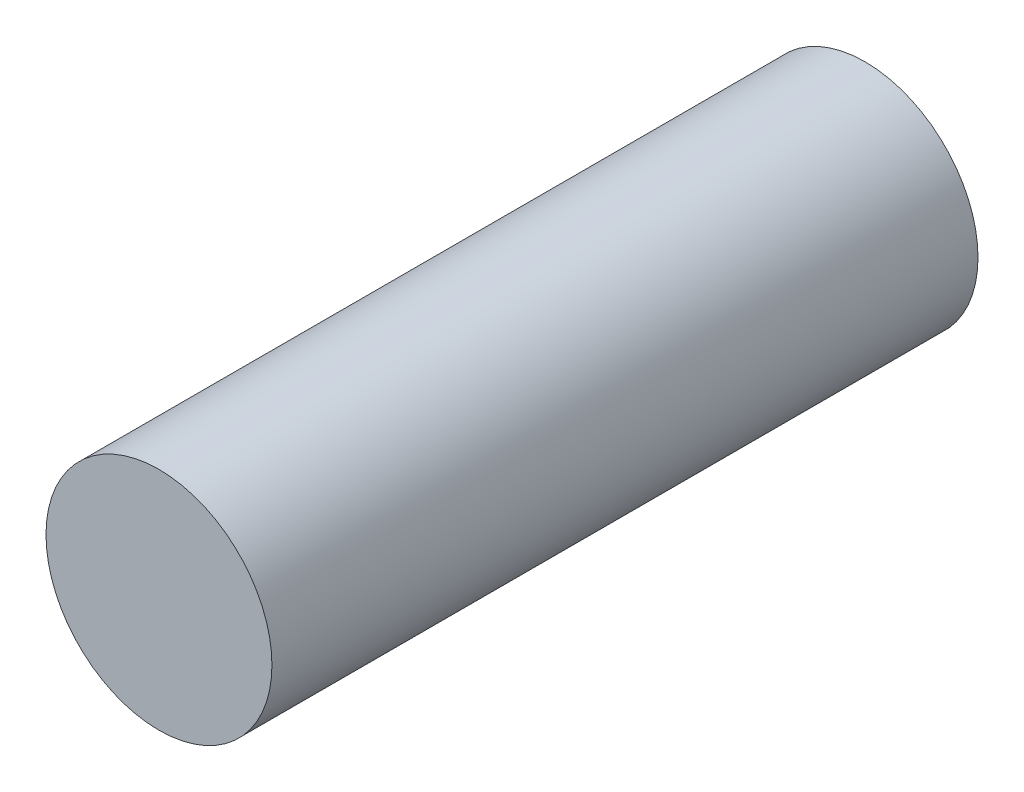
ISO-10303-21;
HEADER;
FILE_DESCRIPTION(('STEP AP214'),'2;1');
FILE_NAME('part.step','',(''),(''),'','','');
FILE_SCHEMA(('AUTOMOTIVE_DESIGN { 1 0 10303 214 1 1 1 1 }'));
ENDSEC;
DATA;
#1=APPLICATION_CONTEXT('core data for automotive mechanical design processes');
#2=APPLICATION_PROTOCOL_DEFINITION('international standard','automotive_design',2000,#1);
#3=PRODUCT_CONTEXT('',#1,'mechanical');
#4=PRODUCT('Part','Part','',(#3));
#5=PRODUCT_RELATED_PRODUCT_CATEGORY('part','',(#4));
#6=PRODUCT_DEFINITION_FORMATION('','',#4);
#7=PRODUCT_DEFINITION_CONTEXT('part definition',#1,'design');
#8=PRODUCT_DEFINITION('design','',#6,#7);
#9=PRODUCT_DEFINITION_SHAPE('','',#8);
#10=(LENGTH_UNIT() NAMED_UNIT(*) SI_UNIT(.MILLI.,.METRE.));
#11=(NAMED_UNIT(*) PLANE_ANGLE_UNIT() SI_UNIT($,.RADIAN.));
#12=(NAMED_UNIT(*) SI_UNIT($,.STERADIAN.) SOLID_ANGLE_UNIT());
#13=UNCERTAINTY_MEASURE_WITH_UNIT(LENGTH_MEASURE(1.E-05),#10,'distance_accuracy_value','');
#14=(GEOMETRIC_REPRESENTATION_CONTEXT(3) GLOBAL_UNCERTAINTY_ASSIGNED_CONTEXT((#13)) GLOBAL_UNIT_ASSIGNED_CONTEXT((#10,
#11,#12)) REPRESENTATION_CONTEXT('',''));
#15=CARTESIAN_POINT('',(0.,0.,0.));
#16=DIRECTION('',(0.,0.,1.));
#17=DIRECTION('',(1.,0.,0.));
#18=AXIS2_PLACEMENT_3D('',#15,#16,#17);
#19=CARTESIAN_POINT('',(0.,0.,20.));
#20=DIRECTION('',(0.,0.,-1.));
#21=DIRECTION('',(-1.,0.,0.));
#22=AXIS2_PLACEMENT_3D('',#19,#20,#21);
#23=CYLINDRICAL_SURFACE('',#22,3.2);
#24=CARTESIAN_POINT('',(0.,0.,20.));
#25=DIRECTION('',(0.,0.,1.));
#26=DIRECTION('',(1.,0.,0.));
#27=AXIS2_PLACEMENT_3D('',#24,#25,#26);
#28=CIRCLE('',#27,3.2);
#29=CARTESIAN_POINT('',(3.2,0.,20.));
#30=VERTEX_POINT('',#29);
#31=EDGE_CURVE('E10',#30,#30,#28,.T.);
#32=ORIENTED_EDGE('',*,*,#31,.F.);
#33=EDGE_LOOP('',(#32));
#34=FACE_BOUND('',#33,.T.);
#35=CARTESIAN_POINT('',(0.,0.,0.));
#36=DIRECTION('',(0.,0.,1.));
#37=DIRECTION('',(1.,0.,0.));
#38=AXIS2_PLACEMENT_3D('',#35,#36,#37);
#39=CIRCLE('',#38,3.2);
#40=CARTESIAN_POINT('',(3.2,0.,0.));
#41=VERTEX_POINT('',#40);
#42=EDGE_CURVE('E33',#41,#41,#39,.T.);
#43=ORIENTED_EDGE('',*,*,#42,.T.);
#44=EDGE_LOOP('',(#43));
#45=FACE_BOUND('',#44,.T.);
#46=ADVANCED_FACE('F30',(#34,#45),#23,.T.);
#47=CARTESIAN_POINT('',(0.,0.,20.));
#48=DIRECTION('',(0.,0.,1.));
#49=DIRECTION('',(1.,0.,0.));
#50=AXIS2_PLACEMENT_3D('',#47,#48,#49);
#51=PLANE('',#50);
#52=ORIENTED_EDGE('',*,*,#31,.T.);
#53=EDGE_LOOP('',(#52));
#54=FACE_BOUND('',#53,.T.);
#55=ADVANCED_FACE('F45',(#54),#51,.T.);
#56=CARTESIAN_POINT('',(0.,0.,0.));
#57=DIRECTION('',(0.,0.,1.));
#58=DIRECTION('',(1.,0.,0.));
#59=AXIS2_PLACEMENT_3D('',#56,#57,#58);
#60=PLANE('',#59);
#61=ORIENTED_EDGE('',*,*,#42,.F.);
#62=EDGE_LOOP('',(#61));
#63=FACE_BOUND('',#62,.T.);
#64=ADVANCED_FACE('F43',(#63),#60,.F.);
#65=CLOSED_SHELL('',(#46,#55,#64));
#66=MANIFOLD_SOLID_BREP('B2',#65);
#67=ADVANCED_BREP_SHAPE_REPRESENTATION('',(#18,#66),#14);
#68=SHAPE_DEFINITION_REPRESENTATION(#9,#67);
ENDSEC;
END-ISO-10303-21;
